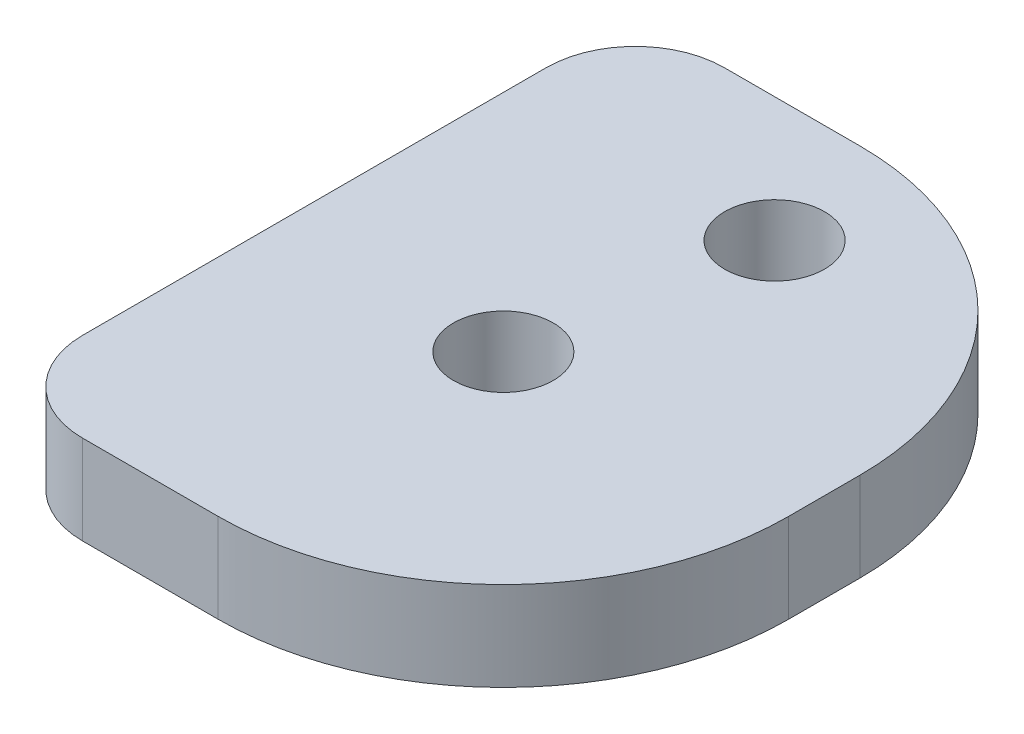
ISO-10303-21;
HEADER;
FILE_DESCRIPTION(('STEP AP214'),'2;1');
FILE_NAME('part.step','',(''),(''),'','','');
FILE_SCHEMA(('AUTOMOTIVE_DESIGN { 1 0 10303 214 1 1 1 1 }'));
ENDSEC;
DATA;
#1=APPLICATION_CONTEXT('core data for automotive mechanical design processes');
#2=APPLICATION_PROTOCOL_DEFINITION('international standard','automotive_design',2000,#1);
#3=PRODUCT_CONTEXT('',#1,'mechanical');
#4=PRODUCT('Part','Part','',(#3));
#5=PRODUCT_RELATED_PRODUCT_CATEGORY('part','',(#4));
#6=PRODUCT_DEFINITION_FORMATION('','',#4);
#7=PRODUCT_DEFINITION_CONTEXT('part definition',#1,'design');
#8=PRODUCT_DEFINITION('design','',#6,#7);
#9=PRODUCT_DEFINITION_SHAPE('','',#8);
#10=(LENGTH_UNIT() NAMED_UNIT(*) SI_UNIT(.MILLI.,.METRE.));
#11=(NAMED_UNIT(*) PLANE_ANGLE_UNIT() SI_UNIT($,.RADIAN.));
#12=(NAMED_UNIT(*) SI_UNIT($,.STERADIAN.) SOLID_ANGLE_UNIT());
#13=UNCERTAINTY_MEASURE_WITH_UNIT(LENGTH_MEASURE(1.E-05),#10,'distance_accuracy_value','');
#14=(GEOMETRIC_REPRESENTATION_CONTEXT(3) GLOBAL_UNCERTAINTY_ASSIGNED_CONTEXT((#13)) GLOBAL_UNIT_ASSIGNED_CONTEXT((#10,
#11,#12)) REPRESENTATION_CONTEXT('',''));
#15=CARTESIAN_POINT('',(0.,0.,0.));
#16=DIRECTION('',(0.,0.,1.));
#17=DIRECTION('',(1.,0.,0.));
#18=AXIS2_PLACEMENT_3D('',#15,#16,#17);
#19=CARTESIAN_POINT('',(-25.4,3.175,11.43));
#20=DIRECTION('',(0.,0.,-1.));
#21=DIRECTION('',(-1.,0.,0.));
#22=AXIS2_PLACEMENT_3D('',#19,#20,#21);
#23=PLANE('',#22);
#24=DIRECTION('',(1.,0.,0.));
#25=VECTOR('',#24,1.);
#26=CARTESIAN_POINT('',(-25.4,3.175,11.43));
#27=LINE('',#26,#25);
#28=CARTESIAN_POINT('',(10.414,3.175,11.43));
#29=VERTEX_POINT('',#28);
#30=CARTESIAN_POINT('',(15.24,3.175,11.43));
#31=VERTEX_POINT('',#30);
#32=EDGE_CURVE('E164',#29,#31,#27,.T.);
#33=ORIENTED_EDGE('',*,*,#32,.F.);
#34=DIRECTION('',(0.,1.,0.));
#35=VECTOR('',#34,1.);
#36=CARTESIAN_POINT('',(10.414,3.175,11.43));
#37=LINE('',#36,#35);
#38=CARTESIAN_POINT('',(10.414,0.,11.43));
#39=VERTEX_POINT('',#38);
#40=EDGE_CURVE('E55',#29,#39,#37,.F.);
#41=ORIENTED_EDGE('',*,*,#40,.T.);
#42=DIRECTION('',(1.,0.,0.));
#43=VECTOR('',#42,1.);
#44=CARTESIAN_POINT('',(-25.4,0.,11.43));
#45=LINE('',#44,#43);
#46=CARTESIAN_POINT('',(15.24,0.,11.43));
#47=VERTEX_POINT('',#46);
#48=EDGE_CURVE('E98',#39,#47,#45,.T.);
#49=ORIENTED_EDGE('',*,*,#48,.T.);
#50=DIRECTION('',(0.,-1.,0.));
#51=VECTOR('',#50,1.);
#52=CARTESIAN_POINT('',(15.24,3.175,11.43));
#53=LINE('',#52,#51);
#54=EDGE_CURVE('E101',#47,#31,#53,.F.);
#55=ORIENTED_EDGE('',*,*,#54,.T.);
#56=EDGE_LOOP('',(#33,#41,#49,#55));
#57=FACE_BOUND('',#56,.T.);
#58=ADVANCED_FACE('F32',(#57),#23,.F.);
#59=CARTESIAN_POINT('',(25.4,3.175,-11.43));
#60=DIRECTION('',(-1.,0.,0.));
#61=DIRECTION('',(0.,0.,1.));
#62=AXIS2_PLACEMENT_3D('',#59,#60,#61);
#63=PLANE('',#62);
#64=DIRECTION('',(0.,0.,-1.));
#65=VECTOR('',#64,1.);
#66=CARTESIAN_POINT('',(25.4,0.,-11.43));
#67=LINE('',#66,#65);
#68=CARTESIAN_POINT('',(25.4,0.,1.27));
#69=VERTEX_POINT('',#68);
#70=CARTESIAN_POINT('',(25.4,0.,-1.27));
#71=VERTEX_POINT('',#70);
#72=EDGE_CURVE('E104',#69,#71,#67,.T.);
#73=ORIENTED_EDGE('',*,*,#72,.T.);
#74=DIRECTION('',(0.,-1.,0.));
#75=VECTOR('',#74,1.);
#76=CARTESIAN_POINT('',(25.4,3.175,-1.27));
#77=LINE('',#76,#75);
#78=CARTESIAN_POINT('',(25.4,3.175,-1.27));
#79=VERTEX_POINT('',#78);
#80=EDGE_CURVE('E136',#71,#79,#77,.F.);
#81=ORIENTED_EDGE('',*,*,#80,.T.);
#82=DIRECTION('',(0.,0.,-1.));
#83=VECTOR('',#82,1.);
#84=CARTESIAN_POINT('',(25.4,3.175,-11.43));
#85=LINE('',#84,#83);
#86=CARTESIAN_POINT('',(25.4,3.175,1.27));
#87=VERTEX_POINT('',#86);
#88=EDGE_CURVE('E120',#87,#79,#85,.T.);
#89=ORIENTED_EDGE('',*,*,#88,.F.);
#90=DIRECTION('',(0.,-1.,0.));
#91=VECTOR('',#90,1.);
#92=CARTESIAN_POINT('',(25.4,3.175,1.27));
#93=LINE('',#92,#91);
#94=EDGE_CURVE('E127',#87,#69,#93,.T.);
#95=ORIENTED_EDGE('',*,*,#94,.T.);
#96=EDGE_LOOP('',(#73,#81,#89,#95));
#97=FACE_BOUND('',#96,.T.);
#98=ADVANCED_FACE('F173',(#97),#63,.F.);
#99=CARTESIAN_POINT('',(-25.4,3.175,-11.43));
#100=DIRECTION('',(0.,0.,1.));
#101=DIRECTION('',(1.,0.,0.));
#102=AXIS2_PLACEMENT_3D('',#99,#100,#101);
#103=PLANE('',#102);
#104=DIRECTION('',(-1.,0.,0.));
#105=VECTOR('',#104,1.);
#106=CARTESIAN_POINT('',(-25.4,0.,-11.43));
#107=LINE('',#106,#105);
#108=CARTESIAN_POINT('',(15.24,0.,-11.43));
#109=VERTEX_POINT('',#108);
#110=CARTESIAN_POINT('',(10.414,0.,-11.43));
#111=VERTEX_POINT('',#110);
#112=EDGE_CURVE('E123',#109,#111,#107,.T.);
#113=ORIENTED_EDGE('',*,*,#112,.T.);
#114=DIRECTION('',(0.,1.,0.));
#115=VECTOR('',#114,1.);
#116=CARTESIAN_POINT('',(10.414,3.175,-11.43));
#117=LINE('',#116,#115);
#118=CARTESIAN_POINT('',(10.414,3.175,-11.43));
#119=VERTEX_POINT('',#118);
#120=EDGE_CURVE('E11',#111,#119,#117,.T.);
#121=ORIENTED_EDGE('',*,*,#120,.T.);
#122=DIRECTION('',(-1.,0.,0.));
#123=VECTOR('',#122,1.);
#124=CARTESIAN_POINT('',(-25.4,3.175,-11.43));
#125=LINE('',#124,#123);
#126=CARTESIAN_POINT('',(15.24,3.175,-11.43));
#127=VERTEX_POINT('',#126);
#128=EDGE_CURVE('E117',#127,#119,#125,.T.);
#129=ORIENTED_EDGE('',*,*,#128,.F.);
#130=DIRECTION('',(0.,-1.,0.));
#131=VECTOR('',#130,1.);
#132=CARTESIAN_POINT('',(15.24,3.175,-11.43));
#133=LINE('',#132,#131);
#134=EDGE_CURVE('E131',#127,#109,#133,.T.);
#135=ORIENTED_EDGE('',*,*,#134,.T.);
#136=EDGE_LOOP('',(#113,#121,#129,#135));
#137=FACE_BOUND('',#136,.T.);
#138=ADVANCED_FACE('F181',(#137),#103,.F.);
#139=CARTESIAN_POINT('',(0.,3.175,0.));
#140=DIRECTION('',(0.,1.,0.));
#141=DIRECTION('',(0.,0.,1.));
#142=AXIS2_PLACEMENT_3D('',#139,#140,#141);
#143=PLANE('',#142);
#144=DIRECTION('',(0.,0.,-1.));
#145=VECTOR('',#144,1.);
#146=CARTESIAN_POINT('',(7.239,3.175,-11.43));
#147=LINE('',#146,#145);
#148=CARTESIAN_POINT('',(7.239,3.175,8.255));
#149=VERTEX_POINT('',#148);
#150=CARTESIAN_POINT('',(7.239,3.175,-8.255));
#151=VERTEX_POINT('',#150);
#152=EDGE_CURVE('E158',#149,#151,#147,.T.);
#153=ORIENTED_EDGE('',*,*,#152,.F.);
#154=CARTESIAN_POINT('',(10.414,3.175,8.255));
#155=DIRECTION('',(0.,1.,0.));
#156=DIRECTION('',(0.,0.,1.));
#157=AXIS2_PLACEMENT_3D('',#154,#155,#156);
#158=CIRCLE('',#157,3.175);
#159=EDGE_CURVE('E145',#149,#29,#158,.T.);
#160=ORIENTED_EDGE('',*,*,#159,.T.);
#161=ORIENTED_EDGE('',*,*,#32,.T.);
#162=CARTESIAN_POINT('',(15.24,3.175,1.27));
#163=DIRECTION('',(0.,1.,0.));
#164=DIRECTION('',(0.,0.,1.));
#165=AXIS2_PLACEMENT_3D('',#162,#163,#164);
#166=CIRCLE('',#165,10.16);
#167=EDGE_CURVE('E114',#31,#87,#166,.T.);
#168=ORIENTED_EDGE('',*,*,#167,.T.);
#169=ORIENTED_EDGE('',*,*,#88,.T.);
#170=CARTESIAN_POINT('',(15.24,3.175,-1.27));
#171=DIRECTION('',(0.,1.,0.));
#172=DIRECTION('',(0.,0.,1.));
#173=AXIS2_PLACEMENT_3D('',#170,#171,#172);
#174=CIRCLE('',#173,10.16);
#175=EDGE_CURVE('E134',#79,#127,#174,.T.);
#176=ORIENTED_EDGE('',*,*,#175,.T.);
#177=ORIENTED_EDGE('',*,*,#128,.T.);
#178=CARTESIAN_POINT('',(10.414,3.175,-8.255));
#179=DIRECTION('',(0.,1.,0.));
#180=DIRECTION('',(0.,0.,1.));
#181=AXIS2_PLACEMENT_3D('',#178,#179,#180);
#182=CIRCLE('',#181,3.175);
#183=EDGE_CURVE('E143',#119,#151,#182,.T.);
#184=ORIENTED_EDGE('',*,*,#183,.T.);
#185=EDGE_LOOP('',(#153,#160,#161,#168,#169,#176,#177,#184));
#186=FACE_BOUND('',#185,.T.);
#187=CARTESIAN_POINT('',(16.637,3.175,-6.99476345699016));
#188=DIRECTION('',(0.,1.,0.));
#189=DIRECTION('',(0.,0.,1.));
#190=AXIS2_PLACEMENT_3D('',#187,#188,#189);
#191=CIRCLE('',#190,1.778);
#192=CARTESIAN_POINT('',(16.637,3.175,-5.21676345699016));
#193=VERTEX_POINT('',#192);
#194=EDGE_CURVE('E157',#193,#193,#191,.T.);
#195=ORIENTED_EDGE('',*,*,#194,.F.);
#196=EDGE_LOOP('',(#195));
#197=FACE_BOUND('',#196,.T.);
#198=CARTESIAN_POINT('',(15.24,3.175,1.27));
#199=DIRECTION('',(0.,1.,0.));
#200=DIRECTION('',(0.,0.,1.));
#201=AXIS2_PLACEMENT_3D('',#198,#199,#200);
#202=CIRCLE('',#201,1.778);
#203=CARTESIAN_POINT('',(15.24,3.175,3.048));
#204=VERTEX_POINT('',#203);
#205=EDGE_CURVE('E169',#204,#204,#202,.T.);
#206=ORIENTED_EDGE('',*,*,#205,.F.);
#207=EDGE_LOOP('',(#206));
#208=FACE_BOUND('',#207,.T.);
#209=ADVANCED_FACE('F162',(#186,#197,#208),#143,.T.);
#210=CARTESIAN_POINT('',(0.,0.,0.));
#211=DIRECTION('',(0.,1.,0.));
#212=DIRECTION('',(0.,0.,1.));
#213=AXIS2_PLACEMENT_3D('',#210,#211,#212);
#214=PLANE('',#213);
#215=CARTESIAN_POINT('',(16.637,0.,-6.99476345699016));
#216=DIRECTION('',(0.,1.,0.));
#217=DIRECTION('',(0.,0.,1.));
#218=AXIS2_PLACEMENT_3D('',#215,#216,#217);
#219=CIRCLE('',#218,1.778);
#220=CARTESIAN_POINT('',(16.637,0.,-5.21676345699016));
#221=VERTEX_POINT('',#220);
#222=EDGE_CURVE('E186',#221,#221,#219,.T.);
#223=ORIENTED_EDGE('',*,*,#222,.T.);
#224=EDGE_LOOP('',(#223));
#225=FACE_BOUND('',#224,.T.);
#226=CARTESIAN_POINT('',(15.24,0.,1.27));
#227=DIRECTION('',(0.,1.,0.));
#228=DIRECTION('',(0.,0.,1.));
#229=AXIS2_PLACEMENT_3D('',#226,#227,#228);
#230=CIRCLE('',#229,1.778);
#231=CARTESIAN_POINT('',(15.24,0.,3.048));
#232=VERTEX_POINT('',#231);
#233=EDGE_CURVE('E105',#232,#232,#230,.T.);
#234=ORIENTED_EDGE('',*,*,#233,.T.);
#235=EDGE_LOOP('',(#234));
#236=FACE_BOUND('',#235,.T.);
#237=ORIENTED_EDGE('',*,*,#48,.F.);
#238=CARTESIAN_POINT('',(10.414,0.,8.255));
#239=DIRECTION('',(0.,1.,0.));
#240=DIRECTION('',(0.,0.,1.));
#241=AXIS2_PLACEMENT_3D('',#238,#239,#240);
#242=CIRCLE('',#241,3.175);
#243=CARTESIAN_POINT('',(7.239,0.,8.255));
#244=VERTEX_POINT('',#243);
#245=EDGE_CURVE('E40',#39,#244,#242,.F.);
#246=ORIENTED_EDGE('',*,*,#245,.T.);
#247=DIRECTION('',(0.,0.,-1.));
#248=VECTOR('',#247,1.);
#249=CARTESIAN_POINT('',(7.239,0.,-11.43));
#250=LINE('',#249,#248);
#251=CARTESIAN_POINT('',(7.239,0.,-8.255));
#252=VERTEX_POINT('',#251);
#253=EDGE_CURVE('E149',#244,#252,#250,.T.);
#254=ORIENTED_EDGE('',*,*,#253,.T.);
#255=CARTESIAN_POINT('',(10.414,0.,-8.255));
#256=DIRECTION('',(0.,1.,0.));
#257=DIRECTION('',(0.,0.,1.));
#258=AXIS2_PLACEMENT_3D('',#255,#256,#257);
#259=CIRCLE('',#258,3.175);
#260=EDGE_CURVE('E47',#252,#111,#259,.F.);
#261=ORIENTED_EDGE('',*,*,#260,.T.);
#262=ORIENTED_EDGE('',*,*,#112,.F.);
#263=CARTESIAN_POINT('',(15.24,0.,-1.27));
#264=DIRECTION('',(0.,1.,0.));
#265=DIRECTION('',(0.,0.,1.));
#266=AXIS2_PLACEMENT_3D('',#263,#264,#265);
#267=CIRCLE('',#266,10.16);
#268=EDGE_CURVE('E129',#109,#71,#267,.F.);
#269=ORIENTED_EDGE('',*,*,#268,.T.);
#270=ORIENTED_EDGE('',*,*,#72,.F.);
#271=CARTESIAN_POINT('',(15.24,0.,1.27));
#272=DIRECTION('',(0.,1.,0.));
#273=DIRECTION('',(0.,0.,1.));
#274=AXIS2_PLACEMENT_3D('',#271,#272,#273);
#275=CIRCLE('',#274,10.16);
#276=EDGE_CURVE('E108',#69,#47,#275,.F.);
#277=ORIENTED_EDGE('',*,*,#276,.T.);
#278=EDGE_LOOP('',(#237,#246,#254,#261,#262,#269,#270,#277));
#279=FACE_BOUND('',#278,.T.);
#280=ADVANCED_FACE('F109',(#225,#236,#279),#214,.F.);
#281=CARTESIAN_POINT('',(15.24,3.175,1.27));
#282=DIRECTION('',(0.,-1.,0.));
#283=DIRECTION('',(0.,0.,-1.));
#284=AXIS2_PLACEMENT_3D('',#281,#282,#283);
#285=CYLINDRICAL_SURFACE('',#284,10.16);
#286=ORIENTED_EDGE('',*,*,#167,.F.);
#287=ORIENTED_EDGE('',*,*,#54,.F.);
#288=ORIENTED_EDGE('',*,*,#276,.F.);
#289=ORIENTED_EDGE('',*,*,#94,.F.);
#290=EDGE_LOOP('',(#286,#287,#288,#289));
#291=FACE_BOUND('',#290,.T.);
#292=ADVANCED_FACE('F116',(#291),#285,.T.);
#293=CARTESIAN_POINT('',(15.24,0.,1.27));
#294=DIRECTION('',(0.,1.,0.));
#295=DIRECTION('',(0.,0.,1.));
#296=AXIS2_PLACEMENT_3D('',#293,#294,#295);
#297=CYLINDRICAL_SURFACE('',#296,1.778);
#298=ORIENTED_EDGE('',*,*,#233,.F.);
#299=EDGE_LOOP('',(#298));
#300=FACE_BOUND('',#299,.T.);
#301=ORIENTED_EDGE('',*,*,#205,.T.);
#302=EDGE_LOOP('',(#301));
#303=FACE_BOUND('',#302,.T.);
#304=ADVANCED_FACE('F196',(#300,#303),#297,.F.);
#305=CARTESIAN_POINT('',(16.637,0.,-6.99476345699016));
#306=DIRECTION('',(0.,1.,0.));
#307=DIRECTION('',(0.,0.,1.));
#308=AXIS2_PLACEMENT_3D('',#305,#306,#307);
#309=CYLINDRICAL_SURFACE('',#308,1.778);
#310=ORIENTED_EDGE('',*,*,#222,.F.);
#311=EDGE_LOOP('',(#310));
#312=FACE_BOUND('',#311,.T.);
#313=ORIENTED_EDGE('',*,*,#194,.T.);
#314=EDGE_LOOP('',(#313));
#315=FACE_BOUND('',#314,.T.);
#316=ADVANCED_FACE('F218',(#312,#315),#309,.F.);
#317=CARTESIAN_POINT('',(15.24,3.175,-1.27));
#318=DIRECTION('',(0.,-1.,0.));
#319=DIRECTION('',(0.,0.,-1.));
#320=AXIS2_PLACEMENT_3D('',#317,#318,#319);
#321=CYLINDRICAL_SURFACE('',#320,10.16);
#322=ORIENTED_EDGE('',*,*,#175,.F.);
#323=ORIENTED_EDGE('',*,*,#80,.F.);
#324=ORIENTED_EDGE('',*,*,#268,.F.);
#325=ORIENTED_EDGE('',*,*,#134,.F.);
#326=EDGE_LOOP('',(#322,#323,#324,#325));
#327=FACE_BOUND('',#326,.T.);
#328=ADVANCED_FACE('F177',(#327),#321,.T.);
#329=CARTESIAN_POINT('',(7.239,0.,-11.43));
#330=DIRECTION('',(1.,0.,0.));
#331=DIRECTION('',(0.,0.,-1.));
#332=AXIS2_PLACEMENT_3D('',#329,#330,#331);
#333=PLANE('',#332);
#334=ORIENTED_EDGE('',*,*,#253,.F.);
#335=DIRECTION('',(0.,1.,0.));
#336=VECTOR('',#335,1.);
#337=CARTESIAN_POINT('',(7.239,0.,8.255));
#338=LINE('',#337,#336);
#339=EDGE_CURVE('E140',#244,#149,#338,.T.);
#340=ORIENTED_EDGE('',*,*,#339,.T.);
#341=ORIENTED_EDGE('',*,*,#152,.T.);
#342=DIRECTION('',(0.,1.,0.));
#343=VECTOR('',#342,1.);
#344=CARTESIAN_POINT('',(7.239,0.,-8.255));
#345=LINE('',#344,#343);
#346=EDGE_CURVE('E138',#151,#252,#345,.F.);
#347=ORIENTED_EDGE('',*,*,#346,.T.);
#348=EDGE_LOOP('',(#334,#340,#341,#347));
#349=FACE_BOUND('',#348,.T.);
#350=ADVANCED_FACE('F153',(#349),#333,.F.);
#351=CARTESIAN_POINT('',(10.414,0.,8.255));
#352=DIRECTION('',(0.,1.,0.));
#353=DIRECTION('',(0.,0.,1.));
#354=AXIS2_PLACEMENT_3D('',#351,#352,#353);
#355=CYLINDRICAL_SURFACE('',#354,3.175);
#356=ORIENTED_EDGE('',*,*,#245,.F.);
#357=ORIENTED_EDGE('',*,*,#40,.F.);
#358=ORIENTED_EDGE('',*,*,#159,.F.);
#359=ORIENTED_EDGE('',*,*,#339,.F.);
#360=EDGE_LOOP('',(#356,#357,#358,#359));
#361=FACE_BOUND('',#360,.T.);
#362=ADVANCED_FACE('F160',(#361),#355,.T.);
#363=CARTESIAN_POINT('',(10.414,3.175,-8.255));
#364=DIRECTION('',(0.,1.,0.));
#365=DIRECTION('',(0.,0.,1.));
#366=AXIS2_PLACEMENT_3D('',#363,#364,#365);
#367=CYLINDRICAL_SURFACE('',#366,3.175);
#368=ORIENTED_EDGE('',*,*,#260,.F.);
#369=ORIENTED_EDGE('',*,*,#346,.F.);
#370=ORIENTED_EDGE('',*,*,#183,.F.);
#371=ORIENTED_EDGE('',*,*,#120,.F.);
#372=EDGE_LOOP('',(#368,#369,#370,#371));
#373=FACE_BOUND('',#372,.T.);
#374=ADVANCED_FACE('F34',(#373),#367,.T.);
#375=CLOSED_SHELL('',(#58,#98,#138,#209,#280,#292,#304,#316,#328,#350,#362,#374));
#376=MANIFOLD_SOLID_BREP('B2',#375);
#377=ADVANCED_BREP_SHAPE_REPRESENTATION('',(#18,#376),#14);
#378=SHAPE_DEFINITION_REPRESENTATION(#9,#377);
ENDSEC;
END-ISO-10303-21;
